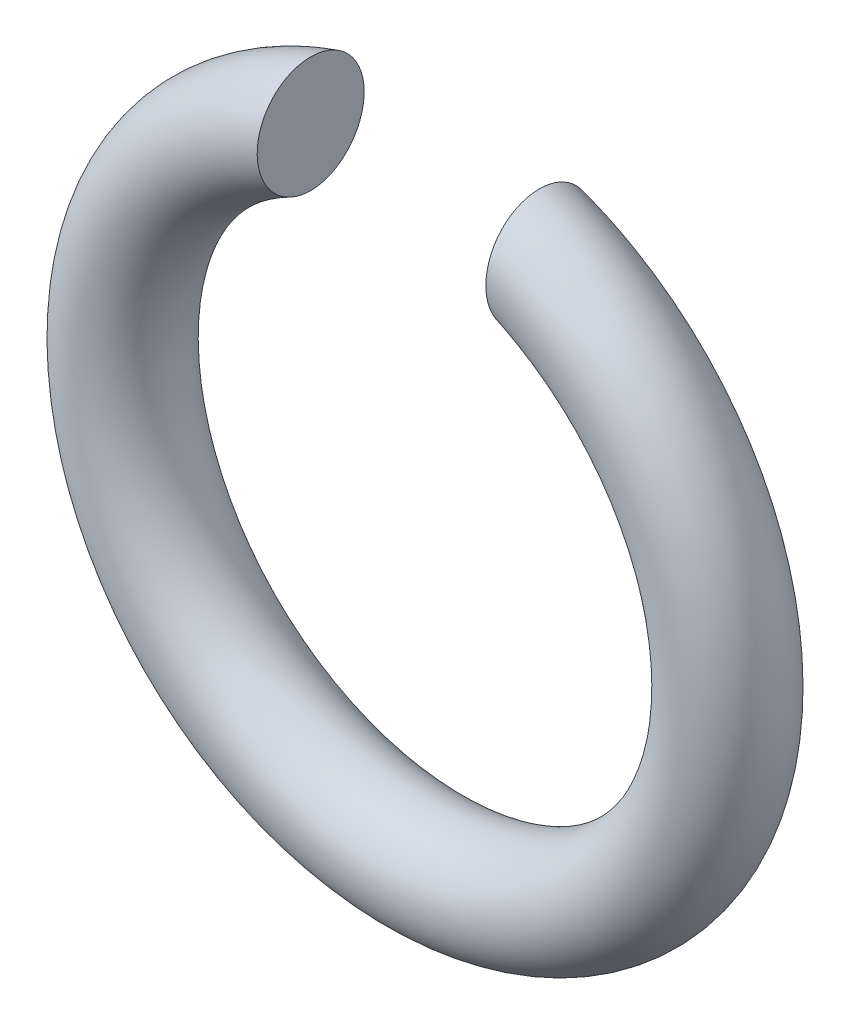
ISO-10303-21;
HEADER;
FILE_DESCRIPTION(('STEP AP214'),'2;1');
FILE_NAME('part.step','',(''),(''),'','','');
FILE_SCHEMA(('AUTOMOTIVE_DESIGN { 1 0 10303 214 1 1 1 1 }'));
ENDSEC;
DATA;
#1=APPLICATION_CONTEXT('core data for automotive mechanical design processes');
#2=APPLICATION_PROTOCOL_DEFINITION('international standard','automotive_design',2000,#1);
#3=PRODUCT_CONTEXT('',#1,'mechanical');
#4=PRODUCT('Part','Part','',(#3));
#5=PRODUCT_RELATED_PRODUCT_CATEGORY('part','',(#4));
#6=PRODUCT_DEFINITION_FORMATION('','',#4);
#7=PRODUCT_DEFINITION_CONTEXT('part definition',#1,'design');
#8=PRODUCT_DEFINITION('design','',#6,#7);
#9=PRODUCT_DEFINITION_SHAPE('','',#8);
#10=(LENGTH_UNIT() NAMED_UNIT(*) SI_UNIT(.MILLI.,.METRE.));
#11=(NAMED_UNIT(*) PLANE_ANGLE_UNIT() SI_UNIT($,.RADIAN.));
#12=(NAMED_UNIT(*) SI_UNIT($,.STERADIAN.) SOLID_ANGLE_UNIT());
#13=UNCERTAINTY_MEASURE_WITH_UNIT(LENGTH_MEASURE(1.E-05),#10,'distance_accuracy_value','');
#14=(GEOMETRIC_REPRESENTATION_CONTEXT(3) GLOBAL_UNCERTAINTY_ASSIGNED_CONTEXT((#13)) GLOBAL_UNIT_ASSIGNED_CONTEXT((#10,
#11,#12)) REPRESENTATION_CONTEXT('',''));
#15=CARTESIAN_POINT('',(0.,0.,0.));
#16=DIRECTION('',(0.,0.,1.));
#17=DIRECTION('',(1.,0.,0.));
#18=AXIS2_PLACEMENT_3D('',#15,#16,#17);
#19=CARTESIAN_POINT('',(0.,0.,0.));
#20=DIRECTION('',(0.,0.,1.));
#21=DIRECTION('',(1.,0.,0.));
#22=AXIS2_PLACEMENT_3D('',#19,#20,#21);
#23=TOROIDAL_SURFACE('',#22,2.0828,0.3683);
#24=CARTESIAN_POINT('',(0.787399999999994,2.32118341584632,2.72621588431935E-12));
#25=CARTESIAN_POINT('',(0.787399999999994,2.32118139729725,0.0198316226106554));
#26=CARTESIAN_POINT('',(0.787399999999994,2.3194843067543,0.0396823441952729));
#27=CARTESIAN_POINT('',(0.787399999999994,2.31274617624424,0.078840495476353));
#28=CARTESIAN_POINT('',(0.787399999999994,2.30769791715218,0.0981466582715236));
#29=CARTESIAN_POINT('',(0.787399999999994,2.29444682338627,0.135604542534393));
#30=CARTESIAN_POINT('',(0.787399999999994,2.28624969935498,0.153758284932415));
#31=CARTESIAN_POINT('',(0.787399999999994,2.26698636189466,0.188458401247001));
#32=CARTESIAN_POINT('',(0.787399999999994,2.25592130672818,0.205005420365927));
#33=CARTESIAN_POINT('',(0.787399999999994,2.23102773922026,0.236418261754081));
#34=CARTESIAN_POINT('',(0.787399999999994,2.21714784978723,0.251243300725182));
#35=CARTESIAN_POINT('',(0.787399999999994,2.18720179562906,0.278488932247695));
#36=CARTESIAN_POINT('',(0.787399999999994,2.17113504652612,0.290908879948384));
#37=CARTESIAN_POINT('',(0.787399999999994,2.13641856702939,0.313667521599587));
#38=CARTESIAN_POINT('',(0.787399999999994,2.11767946626348,0.32386977091631));
#39=CARTESIAN_POINT('',(0.787399999999994,2.07882858140293,0.341190062990524));
#40=CARTESIAN_POINT('',(0.787399999999994,2.05871643686651,0.34830729225863));
#41=CARTESIAN_POINT('',(0.787399999999994,2.01637917713742,0.359712104448149));
#42=CARTESIAN_POINT('',(0.787399999999994,1.99410011345944,0.363799470897505));
#43=CARTESIAN_POINT('',(0.787399999999994,1.94917578739837,0.368387850676986));
#44=CARTESIAN_POINT('',(0.787399999999994,1.9265304193937,0.368887810436018));
#45=CARTESIAN_POINT('',(0.787399999999994,1.88020397140064,0.366276225815172));
#46=CARTESIAN_POINT('',(0.787399999999994,1.8565339556219,0.362965736277176));
#47=CARTESIAN_POINT('',(0.787399999999994,1.81005086561045,0.352512102104426));
#48=CARTESIAN_POINT('',(0.787399999999994,1.78723801718294,0.345367955032043));
#49=CARTESIAN_POINT('',(0.787399999999994,1.74261097315375,0.327197385430602));
#50=CARTESIAN_POINT('',(0.787399999999994,1.7208304910995,0.316087766015951));
#51=CARTESIAN_POINT('',(0.787399999999994,1.67953379441084,0.29023613393669));
#52=CARTESIAN_POINT('',(0.787399999999994,1.66001732540522,0.275494529923074));
#53=CARTESIAN_POINT('',(0.787399999999994,1.62468358954733,0.243306710662233));
#54=CARTESIAN_POINT('',(0.787399999999994,1.60875421097698,0.225984081547477));
#55=CARTESIAN_POINT('',(0.787399999999994,1.58040298348842,0.188652753285699));
#56=CARTESIAN_POINT('',(0.787399999999994,1.56798026717138,0.16864472020311));
#57=CARTESIAN_POINT('',(0.787399999999994,1.54835437978683,0.128608928655657));
#58=CARTESIAN_POINT('',(0.787399999999994,1.54076118894319,0.108772186851992));
#59=CARTESIAN_POINT('',(0.787399999999994,1.52945697068879,0.0680624597154099));
#60=CARTESIAN_POINT('',(0.787399999999994,1.52573302287006,0.0471931685306032));
#61=CARTESIAN_POINT('',(0.787399999999994,1.52334329337584,0.0174804127066191));
#62=CARTESIAN_POINT('',(0.787399999999994,1.52299296173141,0.00874296394527338));
#63=CARTESIAN_POINT('',(0.787399999999994,1.52299706644028,-0.0190823793556422));
#64=CARTESIAN_POINT('',(0.787399999999994,1.52467491280083,-0.0381910315909223));
#65=CARTESIAN_POINT('',(0.787399999999994,1.53131024689755,-0.0758603052564343));
#66=CARTESIAN_POINT('',(0.787399999999994,1.53627582153541,-0.0944194571728603));
#67=CARTESIAN_POINT('',(0.787399999999994,1.54921775665266,-0.130376845549872));
#68=CARTESIAN_POINT('',(0.787399999999994,1.55718327008873,-0.147779001842418));
#69=CARTESIAN_POINT('',(0.787399999999994,1.57577753967871,-0.181078480292326));
#70=CARTESIAN_POINT('',(0.787399999999994,1.58640550886261,-0.196976245208772));
#71=CARTESIAN_POINT('',(0.787399999999994,1.61054565559277,-0.227743684251367));
#72=CARTESIAN_POINT('',(0.787399999999994,1.62417759114731,-0.242519123265345));
#73=CARTESIAN_POINT('',(0.787399999999994,1.65351837908702,-0.26983777902824));
#74=CARTESIAN_POINT('',(0.787399999999994,1.66922815356,-0.282379998904147));
#75=CARTESIAN_POINT('',(0.787399999999994,1.7040206386345,-0.30622802174532));
#76=CARTESIAN_POINT('',(0.787399999999994,1.72328419911781,-0.317270240941368));
#77=CARTESIAN_POINT('',(0.787399999999994,1.76329146566668,-0.336233766648535));
#78=CARTESIAN_POINT('',(0.787399999999994,1.78403576416206,-0.344153815647761));
#79=CARTESIAN_POINT('',(0.787399999999994,1.82812893386332,-0.357218223299049));
#80=CARTESIAN_POINT('',(0.787399999999994,1.85155539481671,-0.36210210334536));
#81=CARTESIAN_POINT('',(0.787399999999994,1.89889582941958,-0.367958055350282));
#82=CARTESIAN_POINT('',(0.787399999999994,1.9228098963863,-0.368929371330913));
#83=CARTESIAN_POINT('',(0.787399999999994,1.9709556790247,-0.366859222520746));
#84=CARTESIAN_POINT('',(0.787399999999994,1.99518401660395,-0.363736074373923));
#85=CARTESIAN_POINT('',(0.787399999999994,2.04273314030471,-0.353323065668496));
#86=CARTESIAN_POINT('',(0.787399999999994,2.06605403553796,-0.346033707722799));
#87=CARTESIAN_POINT('',(0.787399999999994,2.11025500181549,-0.327703012290947));
#88=CARTESIAN_POINT('',(0.787399999999994,2.13119090570737,-0.31679670019241));
#89=CARTESIAN_POINT('',(0.787399999999994,2.1707664754749,-0.291403183439293));
#90=CARTESIAN_POINT('',(0.787399999999994,2.18940718592615,-0.276917616848001));
#91=CARTESIAN_POINT('',(0.787399999999994,2.22261381071164,-0.245740018041875));
#92=CARTESIAN_POINT('',(0.787399999999994,2.23736096833722,-0.229241062510215));
#93=CARTESIAN_POINT('',(0.787399999999994,2.26366478149539,-0.19385559999788));
#94=CARTESIAN_POINT('',(0.787399999999994,2.2752211368124,-0.174968868600177));
#95=CARTESIAN_POINT('',(0.787399999999994,2.29408230286707,-0.136591852795338));
#96=CARTESIAN_POINT('',(0.787399999999994,2.30160137055043,-0.117206544528007));
#97=CARTESIAN_POINT('',(0.787399999999994,2.31310522409587,-0.0774510889402233));
#98=CARTESIAN_POINT('',(0.787399999999994,2.31709883848113,-0.0570835371952322));
#99=CARTESIAN_POINT('',(0.787399999999994,2.3205437254977,-0.0244057524353961));
#100=CARTESIAN_POINT('',(0.787399999999994,2.32118465827655,-0.0122064940241307));
#101=CARTESIAN_POINT('',(0.787399999999994,2.32118341584632,2.72621588431935E-12));
#102=B_SPLINE_CURVE_WITH_KNOTS('',3,(#24,#25,#26,#27,#28,#29,#30,#31,#32,#33,#34,#35,#36,#37,
#38,#39,#40,#41,#42,#43,#44,#45,#46,#47,#48,#49,#50,#51,#52,#53,#54,#55,#56,#57,#58,#59,#60,#61,
#62,#63,#64,#65,#66,#67,#68,#69,#70,#71,#72,#73,#74,#75,#76,#77,#78,#79,#80,#81,#82,#83,#84,#85,
#86,#87,#88,#89,#90,#91,#92,#93,#94,#95,#96,#97,#98,#99,#100,#101),.UNSPECIFIED.,.T.,.F.,(4,2,2,
2,2,2,2,2,2,2,2,2,2,2,2,2,2,2,2,2,2,2,2,2,2,2,2,2,2,2,2,2,2,2,2,2,2,2,4),(0.,0.0594563783993291,
0.119041255851863,0.178518579102217,0.237971918756412,0.298628018954036,0.359300359756775,
0.423030600923784,0.486777636919266,0.554432621222626,0.622107474034226,0.693482294583427,
0.764875787560896,0.837864858808152,0.910845721472679,0.98106239728139,1.05126168922573,
1.11463641310227,1.17779882544984,1.20401565550851,1.26123646755958,1.31859855246443,
1.37575519092532,1.43289495489088,1.49295859271354,1.55304897512421,1.61937843370397,
1.68573458047332,1.75719670362464,1.82867263388557,1.90159641467561,1.97451139977339,
2.04496390562813,2.11538422807604,2.18142805807474,2.24747809987659,2.30954743270926,
2.37146088547952,2.40805667706643),.UNSPECIFIED.);
#103=CARTESIAN_POINT('',(0.787399999999994,2.32118341584632,2.72621588431935E-12));
#104=VERTEX_POINT('',#103);
#105=EDGE_CURVE('E10',#104,#104,#102,.T.);
#106=ORIENTED_EDGE('',*,*,#105,.T.);
#107=EDGE_LOOP('',(#106));
#108=FACE_BOUND('',#107,.T.);
#109=CARTESIAN_POINT('',(-0.787399999999966,1.52299425146652,-3.19463875588183E-12));
#110=CARTESIAN_POINT('',(-0.787399999999966,1.52299706644011,0.0190823793524148));
#111=CARTESIAN_POINT('',(-0.787399999999966,1.52467491280046,0.0381910315876781));
#112=CARTESIAN_POINT('',(-0.787399999999966,1.5313102468968,0.0758603052531906));
#113=CARTESIAN_POINT('',(-0.787399999999966,1.53627582153446,0.0944194571696338));
#114=CARTESIAN_POINT('',(-0.787399999999966,1.54921775665134,0.130376845546713));
#115=CARTESIAN_POINT('',(-0.787399999999966,1.55718327008723,0.147779001839308));
#116=CARTESIAN_POINT('',(-0.787399999999966,1.57577753967685,0.181078480289342));
#117=CARTESIAN_POINT('',(-0.787399999999966,1.58640550886057,0.196976245205864));
#118=CARTESIAN_POINT('',(-0.787399999999966,1.61054565559038,0.227743684248619));
#119=CARTESIAN_POINT('',(-0.787399999999966,1.62417759114474,0.242519123262683));
#120=CARTESIAN_POINT('',(-0.787399999999966,1.65351837908411,0.269837779025777));
#121=CARTESIAN_POINT('',(-0.787399999999966,1.66922815355692,0.282379998901797));
#122=CARTESIAN_POINT('',(-0.787399999999966,1.70402063863109,0.306228021743233));
#123=CARTESIAN_POINT('',(-0.787399999999966,1.72328419911425,0.317270240939433));
#124=CARTESIAN_POINT('',(-0.787399999999966,1.76329146566281,0.336233766646933));
#125=CARTESIAN_POINT('',(-0.787399999999966,1.78403576415805,0.344153815646339));
#126=CARTESIAN_POINT('',(-0.787399999999966,1.82812893385909,0.357218223298038));
#127=CARTESIAN_POINT('',(-0.787399999999966,1.85155539481238,0.362102103344578));
#128=CARTESIAN_POINT('',(-0.787399999999966,1.89889582941512,0.367958055349976));
#129=CARTESIAN_POINT('',(-0.787399999999966,1.9228098963818,0.368929371330853));
#130=CARTESIAN_POINT('',(-0.787399999999966,1.97095567902019,0.3668592225212));
#131=CARTESIAN_POINT('',(-0.787399999999966,1.99518401659948,0.363736074374635));
#132=CARTESIAN_POINT('',(-0.787399999999966,2.04273314030037,0.35332306566972));
#133=CARTESIAN_POINT('',(-0.787399999999966,2.0660540355337,0.346033707724277));
#134=CARTESIAN_POINT('',(-0.787399999999966,2.11025500181148,0.327703012292899));
#135=CARTESIAN_POINT('',(-0.787399999999966,2.13119090570352,0.316796700194576));
#136=CARTESIAN_POINT('',(-0.787399999999966,2.17076647547139,0.29140318344186));
#137=CARTESIAN_POINT('',(-0.787399999999966,2.18940718592284,0.276917616850754));
#138=CARTESIAN_POINT('',(-0.787399999999966,2.22261381070875,0.245740018044942));
#139=CARTESIAN_POINT('',(-0.787399999999966,2.23736096833454,0.229241062513413));
#140=CARTESIAN_POINT('',(-0.787399999999966,2.26366478149316,0.193855600001298));
#141=CARTESIAN_POINT('',(-0.787399999999966,2.27522113681042,0.174968868603684));
#142=CARTESIAN_POINT('',(-0.787399999999966,2.29408230286554,0.136591852798982));
#143=CARTESIAN_POINT('',(-0.787399999999966,2.30160137054913,0.1172065445317));
#144=CARTESIAN_POINT('',(-0.787399999999966,2.31310522409503,0.0774510889439753));
#145=CARTESIAN_POINT('',(-0.787399999999966,2.31709883848052,0.0570835371989931));
#146=CARTESIAN_POINT('',(-0.787399999999966,2.32054372549748,0.0244057524388127));
#147=CARTESIAN_POINT('',(-0.787399999999966,2.32118465827646,0.0122064940272048));
#148=CARTESIAN_POINT('',(-0.787399999999966,2.32118139729741,-0.0198316226079194));
#149=CARTESIAN_POINT('',(-0.787399999999966,2.31948430675462,-0.0396823441925397));
#150=CARTESIAN_POINT('',(-0.787399999999966,2.31274617624487,-0.0788404954736519));
#151=CARTESIAN_POINT('',(-0.787399999999966,2.30769791715296,-0.098146658268852));
#152=CARTESIAN_POINT('',(-0.787399999999966,2.29444682338736,-0.135604542531806));
#153=CARTESIAN_POINT('',(-0.787399999999966,2.28624969935622,-0.153758284929883));
#154=CARTESIAN_POINT('',(-0.787399999999966,2.26698636189618,-0.188458401244603));
#155=CARTESIAN_POINT('',(-0.787399999999966,2.25592130672983,-0.205005420363606));
#156=CARTESIAN_POINT('',(-0.787399999999966,2.23102773922217,-0.23641826175193));
#157=CARTESIAN_POINT('',(-0.787399999999966,2.21714784978927,-0.251243300723124));
#158=CARTESIAN_POINT('',(-0.787399999999966,2.18720179563133,-0.278488932245842));
#159=CARTESIAN_POINT('',(-0.787399999999966,2.17113504652851,-0.290908879946642));
#160=CARTESIAN_POINT('',(-0.787399999999966,2.136418567032,-0.313667521598081));
#161=CARTESIAN_POINT('',(-0.787399999999966,2.11767946626618,-0.323869770914932));
#162=CARTESIAN_POINT('',(-0.787399999999966,2.07882858140582,-0.341190062989417));
#163=CARTESIAN_POINT('',(-0.787399999999966,2.05871643686948,-0.348307292257666));
#164=CARTESIAN_POINT('',(-0.787399999999966,2.01637917714053,-0.35971210444749));
#165=CARTESIAN_POINT('',(-0.787399999999966,1.99410011346261,-0.363799470897009));
#166=CARTESIAN_POINT('',(-0.787399999999966,1.94917578740164,-0.368387850676825));
#167=CARTESIAN_POINT('',(-0.787399999999966,1.92653041939701,-0.36888781043603));
#168=CARTESIAN_POINT('',(-0.787399999999966,1.88020397140399,-0.366276225815544));
#169=CARTESIAN_POINT('',(-0.787399999999966,1.85653395562525,-0.362965736277735));
#170=CARTESIAN_POINT('',(-0.787399999999966,1.81005086561376,-0.352512102105361));
#171=CARTESIAN_POINT('',(-0.787399999999966,1.78723801718622,-0.345367955033166));
#172=CARTESIAN_POINT('',(-0.787399999999966,1.74261097315691,-0.327197385432095));
#173=CARTESIAN_POINT('',(-0.787399999999966,1.72083049110256,-0.316087766017622));
#174=CARTESIAN_POINT('',(-0.787399999999966,1.67953379441369,-0.290236133938703));
#175=CARTESIAN_POINT('',(-0.787399999999966,1.66001732540794,-0.275494529925252));
#176=CARTESIAN_POINT('',(-0.787399999999966,1.62468358954974,-0.243306710664691));
#177=CARTESIAN_POINT('',(-0.787399999999966,1.60875421097921,-0.225984081550043));
#178=CARTESIAN_POINT('',(-0.787399999999966,1.58040298349027,-0.188652753288452));
#179=CARTESIAN_POINT('',(-0.787399999999966,1.56798026717302,-0.16864472020594));
#180=CARTESIAN_POINT('',(-0.787399999999966,1.54835437978806,-0.128608928658573));
#181=CARTESIAN_POINT('',(-0.787399999999966,1.54076118894421,-0.108772186854919));
#182=CARTESIAN_POINT('',(-0.787399999999966,1.52945697068942,-0.0680624597183208));
#183=CARTESIAN_POINT('',(-0.787399999999966,1.52573302287049,-0.0471931685334865));
#184=CARTESIAN_POINT('',(-0.787399999999966,1.52334329337601,-0.0174804127095783));
#185=CARTESIAN_POINT('',(-0.787399999999966,1.52299296173151,-0.00874296394835173));
#186=CARTESIAN_POINT('',(-0.787399999999966,1.52299425146652,-3.19463875588183E-12));
#187=B_SPLINE_CURVE_WITH_KNOTS('',3,(#109,#110,#111,#112,#113,#114,#115,#116,#117,#118,#119,
#120,#121,#122,#123,#124,#125,#126,#127,#128,#129,#130,#131,#132,#133,#134,#135,#136,#137,#138,
#139,#140,#141,#142,#143,#144,#145,#146,#147,#148,#149,#150,#151,#152,#153,#154,#155,#156,#157,
#158,#159,#160,#161,#162,#163,#164,#165,#166,#167,#168,#169,#170,#171,#172,#173,#174,#175,#176,
#177,#178,#179,#180,#181,#182,#183,#184,#185,#186),.UNSPECIFIED.,.T.,.F.,(4,2,2,2,2,2,2,2,2,2,2,
2,2,2,2,2,2,2,2,2,2,2,2,2,2,2,2,2,2,2,2,2,2,2,2,2,2,2,4),(0.,0.0572208120509791,
0.11458289695572,0.171739535416515,0.228879299381981,0.288942937204466,0.349033319614964,
0.415362778194525,0.481718924963682,0.55318104811489,0.624656978375715,0.697580759165773,
0.770495744263569,0.840948250118431,0.911368572566464,0.97741240256531,1.0434624443673,
1.10553177720007,1.16744522997044,1.20404102155839,1.26349739995769,1.32308227741019,
1.38255960066051,1.44201294031468,1.50266904051224,1.56334138131493,1.62707162248185,
1.69081865847724,1.75847364278051,1.82614849559201,1.89752331614114,1.96891680911853,
2.04190588036579,2.11488674303033,2.18510341883916,2.25530271078363,2.31867743466035,
2.38183984700811,2.40805667706642),.UNSPECIFIED.);
#188=CARTESIAN_POINT('',(-0.787399999999966,1.52299425146652,-3.19463875588183E-12));
#189=VERTEX_POINT('',#188);
#190=EDGE_CURVE('E20',#189,#189,#187,.T.);
#191=ORIENTED_EDGE('',*,*,#190,.T.);
#192=EDGE_LOOP('',(#191));
#193=FACE_BOUND('',#192,.T.);
#194=ADVANCED_FACE('F15',(#108,#193),#23,.T.);
#195=CARTESIAN_POINT('',(0.787399999999994,2.4511,-0.368300000000002));
#196=DIRECTION('',(1.,0.,0.));
#197=DIRECTION('',(0.,1.,0.));
#198=AXIS2_PLACEMENT_3D('',#195,#196,#197);
#199=PLANE('',#198);
#200=ORIENTED_EDGE('',*,*,#105,.F.);
#201=EDGE_LOOP('',(#200));
#202=FACE_BOUND('',#201,.T.);
#203=ADVANCED_FACE('F34',(#202),#199,.F.);
#204=CARTESIAN_POINT('',(-0.787399999999966,2.4511,-0.368300000000002));
#205=DIRECTION('',(-1.,0.,0.));
#206=DIRECTION('',(0.,-1.,0.));
#207=AXIS2_PLACEMENT_3D('',#204,#205,#206);
#208=PLANE('',#207);
#209=ORIENTED_EDGE('',*,*,#190,.F.);
#210=EDGE_LOOP('',(#209));
#211=FACE_BOUND('',#210,.T.);
#212=ADVANCED_FACE('F17',(#211),#208,.F.);
#213=CLOSED_SHELL('',(#194,#203,#212));
#214=MANIFOLD_SOLID_BREP('B1',#213);
#215=ADVANCED_BREP_SHAPE_REPRESENTATION('',(#18,#214),#14);
#216=SHAPE_DEFINITION_REPRESENTATION(#9,#215);
ENDSEC;
END-ISO-10303-21;
